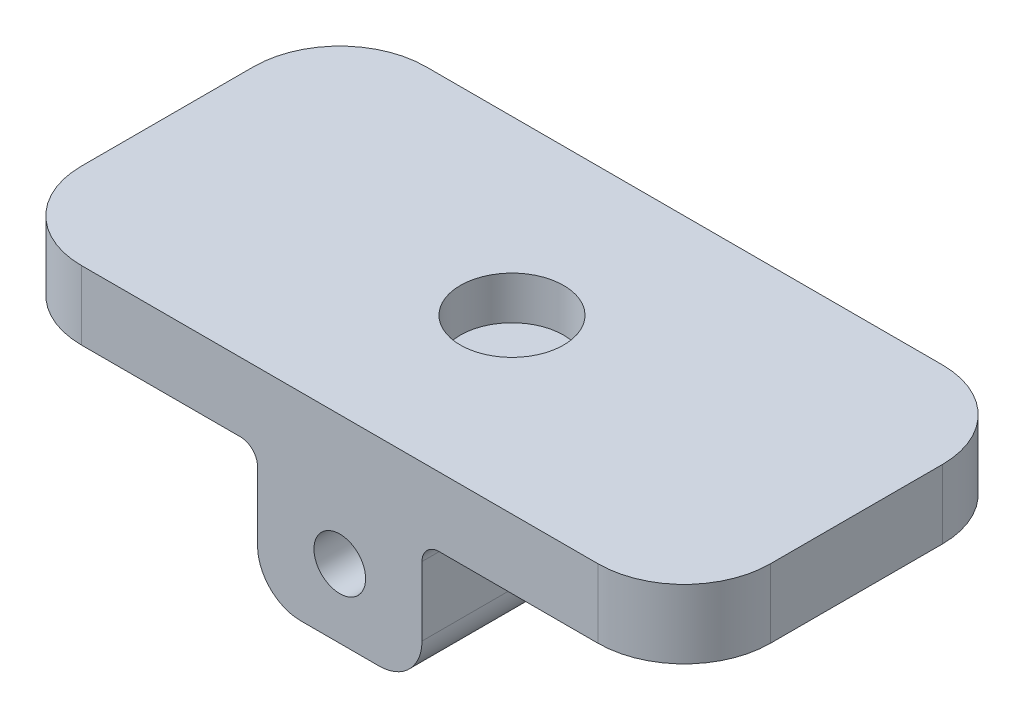
ISO-10303-21;
HEADER;
FILE_DESCRIPTION(('STEP AP214'),'2;1');
FILE_NAME('part.step','',(''),(''),'','','');
FILE_SCHEMA(('AUTOMOTIVE_DESIGN { 1 0 10303 214 1 1 1 1 }'));
ENDSEC;
DATA;
#1=APPLICATION_CONTEXT('core data for automotive mechanical design processes');
#2=APPLICATION_PROTOCOL_DEFINITION('international standard','automotive_design',2000,#1);
#3=PRODUCT_CONTEXT('',#1,'mechanical');
#4=PRODUCT('Part','Part','',(#3));
#5=PRODUCT_RELATED_PRODUCT_CATEGORY('part','',(#4));
#6=PRODUCT_DEFINITION_FORMATION('','',#4);
#7=PRODUCT_DEFINITION_CONTEXT('part definition',#1,'design');
#8=PRODUCT_DEFINITION('design','',#6,#7);
#9=PRODUCT_DEFINITION_SHAPE('','',#8);
#10=(LENGTH_UNIT() NAMED_UNIT(*) SI_UNIT(.MILLI.,.METRE.));
#11=(NAMED_UNIT(*) PLANE_ANGLE_UNIT() SI_UNIT($,.RADIAN.));
#12=(NAMED_UNIT(*) SI_UNIT($,.STERADIAN.) SOLID_ANGLE_UNIT());
#13=UNCERTAINTY_MEASURE_WITH_UNIT(LENGTH_MEASURE(1.E-05),#10,'distance_accuracy_value','');
#14=(GEOMETRIC_REPRESENTATION_CONTEXT(3) GLOBAL_UNCERTAINTY_ASSIGNED_CONTEXT((#13)) GLOBAL_UNIT_ASSIGNED_CONTEXT((#10,
#11,#12)) REPRESENTATION_CONTEXT('',''));
#15=CARTESIAN_POINT('',(0.,0.,0.));
#16=DIRECTION('',(0.,0.,1.));
#17=DIRECTION('',(1.,0.,0.));
#18=AXIS2_PLACEMENT_3D('',#15,#16,#17);
#19=CARTESIAN_POINT('',(-9.54545454545454,-8.00000000000001,40.));
#20=DIRECTION('',(1.,0.,0.));
#21=DIRECTION('',(0.,1.,0.));
#22=AXIS2_PLACEMENT_3D('',#19,#20,#21);
#23=PLANE('',#22);
#24=DIRECTION('',(0.,1.,0.));
#25=VECTOR('',#24,1.);
#26=CARTESIAN_POINT('',(-9.54545454545454,-8.00000000000001,18.));
#27=LINE('',#26,#25);
#28=CARTESIAN_POINT('',(-9.54545454545454,-18.,18.));
#29=VERTEX_POINT('',#28);
#30=CARTESIAN_POINT('',(-9.54545454545454,-10.,18.));
#31=VERTEX_POINT('',#30);
#32=EDGE_CURVE('E263',#29,#31,#27,.T.);
#33=ORIENTED_EDGE('',*,*,#32,.T.);
#34=DIRECTION('',(0.,0.,-1.));
#35=VECTOR('',#34,1.);
#36=CARTESIAN_POINT('',(-9.54545454545454,-10.,0.));
#37=LINE('',#36,#35);
#38=CARTESIAN_POINT('',(-9.54545454545454,-10.,0.));
#39=VERTEX_POINT('',#38);
#40=EDGE_CURVE('E335',#31,#39,#37,.T.);
#41=ORIENTED_EDGE('',*,*,#40,.T.);
#42=DIRECTION('',(0.,-1.,0.));
#43=VECTOR('',#42,1.);
#44=CARTESIAN_POINT('',(-9.54545454545454,-8.00000000000001,0.));
#45=LINE('',#44,#43);
#46=CARTESIAN_POINT('',(-9.54545454545454,-18.,0.));
#47=VERTEX_POINT('',#46);
#48=EDGE_CURVE('E369',#39,#47,#45,.T.);
#49=ORIENTED_EDGE('',*,*,#48,.T.);
#50=DIRECTION('',(0.,0.,-1.));
#51=VECTOR('',#50,1.);
#52=CARTESIAN_POINT('',(-9.54545454545454,-18.,40.));
#53=LINE('',#52,#51);
#54=EDGE_CURVE('E338',#47,#29,#53,.F.);
#55=ORIENTED_EDGE('',*,*,#54,.T.);
#56=EDGE_LOOP('',(#33,#41,#49,#55));
#57=FACE_BOUND('',#56,.T.);
#58=ADVANCED_FACE('F33',(#57),#23,.F.);
#59=CARTESIAN_POINT('',(-9.54545454545454,-23.,40.));
#60=DIRECTION('',(0.,1.,0.));
#61=DIRECTION('',(0.,0.,1.));
#62=AXIS2_PLACEMENT_3D('',#59,#60,#61);
#63=PLANE('',#62);
#64=DIRECTION('',(1.,0.,0.));
#65=VECTOR('',#64,1.);
#66=CARTESIAN_POINT('',(-9.54545454545454,-23.,0.));
#67=LINE('',#66,#65);
#68=CARTESIAN_POINT('',(-4.54545454545454,-23.,0.));
#69=VERTEX_POINT('',#68);
#70=CARTESIAN_POINT('',(4.54545454545455,-23.,0.));
#71=VERTEX_POINT('',#70);
#72=EDGE_CURVE('E419',#69,#71,#67,.T.);
#73=ORIENTED_EDGE('',*,*,#72,.T.);
#74=DIRECTION('',(0.,0.,-1.));
#75=VECTOR('',#74,1.);
#76=CARTESIAN_POINT('',(4.54545454545455,-23.,40.));
#77=LINE('',#76,#75);
#78=CARTESIAN_POINT('',(4.54545454545455,-23.,18.));
#79=VERTEX_POINT('',#78);
#80=EDGE_CURVE('E471',#71,#79,#77,.F.);
#81=ORIENTED_EDGE('',*,*,#80,.T.);
#82=DIRECTION('',(1.,0.,0.));
#83=VECTOR('',#82,1.);
#84=CARTESIAN_POINT('',(-40.,-23.,18.));
#85=LINE('',#84,#83);
#86=CARTESIAN_POINT('',(-4.54545454545454,-23.,18.));
#87=VERTEX_POINT('',#86);
#88=EDGE_CURVE('E436',#87,#79,#85,.T.);
#89=ORIENTED_EDGE('',*,*,#88,.F.);
#90=DIRECTION('',(0.,0.,-1.));
#91=VECTOR('',#90,1.);
#92=CARTESIAN_POINT('',(-4.54545454545454,-23.,40.));
#93=LINE('',#92,#91);
#94=EDGE_CURVE('E473',#87,#69,#93,.T.);
#95=ORIENTED_EDGE('',*,*,#94,.T.);
#96=EDGE_LOOP('',(#73,#81,#89,#95));
#97=FACE_BOUND('',#96,.T.);
#98=ADVANCED_FACE('F313',(#97),#63,.F.);
#99=CARTESIAN_POINT('',(9.54545454545456,-8.00000000000001,40.));
#100=DIRECTION('',(-1.,0.,0.));
#101=DIRECTION('',(0.,-1.,0.));
#102=AXIS2_PLACEMENT_3D('',#99,#100,#101);
#103=PLANE('',#102);
#104=DIRECTION('',(0.,1.,0.));
#105=VECTOR('',#104,1.);
#106=CARTESIAN_POINT('',(9.54545454545456,-8.00000000000001,0.));
#107=LINE('',#106,#105);
#108=CARTESIAN_POINT('',(9.54545454545455,-18.,0.));
#109=VERTEX_POINT('',#108);
#110=CARTESIAN_POINT('',(9.54545454545456,-10.,0.));
#111=VERTEX_POINT('',#110);
#112=EDGE_CURVE('E397',#109,#111,#107,.T.);
#113=ORIENTED_EDGE('',*,*,#112,.T.);
#114=DIRECTION('',(0.,0.,-1.));
#115=VECTOR('',#114,1.);
#116=CARTESIAN_POINT('',(9.54545454545456,-10.,18.));
#117=LINE('',#116,#115);
#118=CARTESIAN_POINT('',(9.54545454545456,-10.,18.));
#119=VERTEX_POINT('',#118);
#120=EDGE_CURVE('E348',#111,#119,#117,.F.);
#121=ORIENTED_EDGE('',*,*,#120,.T.);
#122=DIRECTION('',(0.,-1.,0.));
#123=VECTOR('',#122,1.);
#124=CARTESIAN_POINT('',(9.54545454545456,-8.00000000000001,18.));
#125=LINE('',#124,#123);
#126=CARTESIAN_POINT('',(9.54545454545455,-18.,18.));
#127=VERTEX_POINT('',#126);
#128=EDGE_CURVE('E340',#119,#127,#125,.T.);
#129=ORIENTED_EDGE('',*,*,#128,.T.);
#130=DIRECTION('',(0.,0.,-1.));
#131=VECTOR('',#130,1.);
#132=CARTESIAN_POINT('',(9.54545454545455,-18.,40.));
#133=LINE('',#132,#131);
#134=EDGE_CURVE('E486',#127,#109,#133,.T.);
#135=ORIENTED_EDGE('',*,*,#134,.T.);
#136=EDGE_LOOP('',(#113,#121,#129,#135));
#137=FACE_BOUND('',#136,.T.);
#138=ADVANCED_FACE('F309',(#137),#103,.F.);
#139=CARTESIAN_POINT('',(0.,-15.,40.));
#140=DIRECTION('',(0.,0.,-1.));
#141=DIRECTION('',(-1.,0.,0.));
#142=AXIS2_PLACEMENT_3D('',#139,#140,#141);
#143=CYLINDRICAL_SURFACE('',#142,3.);
#144=CARTESIAN_POINT('',(0.,-15.,18.));
#145=DIRECTION('',(0.,0.,-1.));
#146=DIRECTION('',(-1.,0.,0.));
#147=AXIS2_PLACEMENT_3D('',#144,#145,#146);
#148=CIRCLE('',#147,3.);
#149=CARTESIAN_POINT('',(-3.,-15.,18.));
#150=VERTEX_POINT('',#149);
#151=EDGE_CURVE('E226',#150,#150,#148,.T.);
#152=ORIENTED_EDGE('',*,*,#151,.F.);
#153=EDGE_LOOP('',(#152));
#154=FACE_BOUND('',#153,.T.);
#155=CARTESIAN_POINT('',(0.,-15.,0.));
#156=DIRECTION('',(0.,0.,1.));
#157=DIRECTION('',(1.,0.,0.));
#158=AXIS2_PLACEMENT_3D('',#155,#156,#157);
#159=CIRCLE('',#158,3.);
#160=CARTESIAN_POINT('',(3.,-15.,0.));
#161=VERTEX_POINT('',#160);
#162=EDGE_CURVE('E448',#161,#161,#159,.T.);
#163=ORIENTED_EDGE('',*,*,#162,.F.);
#164=EDGE_LOOP('',(#163));
#165=FACE_BOUND('',#164,.T.);
#166=ADVANCED_FACE('F282',(#154,#165),#143,.F.);
#167=CARTESIAN_POINT('',(0.,0.,40.));
#168=DIRECTION('',(0.,0.,-1.));
#169=DIRECTION('',(-1.,0.,0.));
#170=AXIS2_PLACEMENT_3D('',#167,#168,#169);
#171=PLANE('',#170);
#172=DIRECTION('',(1.,0.,0.));
#173=VECTOR('',#172,1.);
#174=CARTESIAN_POINT('',(-9.54545454545454,-23.,40.));
#175=LINE('',#174,#173);
#176=CARTESIAN_POINT('',(-4.54545454545454,-23.,40.));
#177=VERTEX_POINT('',#176);
#178=CARTESIAN_POINT('',(4.54545454545455,-23.,40.));
#179=VERTEX_POINT('',#178);
#180=EDGE_CURVE('E457',#177,#179,#175,.T.);
#181=ORIENTED_EDGE('',*,*,#180,.T.);
#182=CARTESIAN_POINT('',(4.54545454545455,-18.,40.));
#183=DIRECTION('',(0.,0.,-1.));
#184=DIRECTION('',(-1.,0.,0.));
#185=AXIS2_PLACEMENT_3D('',#182,#183,#184);
#186=CIRCLE('',#185,5.);
#187=CARTESIAN_POINT('',(9.54545454545455,-18.,40.));
#188=VERTEX_POINT('',#187);
#189=EDGE_CURVE('E488',#179,#188,#186,.F.);
#190=ORIENTED_EDGE('',*,*,#189,.T.);
#191=DIRECTION('',(0.,1.,0.));
#192=VECTOR('',#191,1.);
#193=CARTESIAN_POINT('',(9.54545454545456,-8.00000000000001,40.));
#194=LINE('',#193,#192);
#195=CARTESIAN_POINT('',(9.54545454545456,-10.,40.));
#196=VERTEX_POINT('',#195);
#197=EDGE_CURVE('E460',#188,#196,#194,.T.);
#198=ORIENTED_EDGE('',*,*,#197,.T.);
#199=CARTESIAN_POINT('',(11.5454545454546,-10.,40.));
#200=DIRECTION('',(0.,0.,-1.));
#201=DIRECTION('',(-1.,0.,0.));
#202=AXIS2_PLACEMENT_3D('',#199,#200,#201);
#203=CIRCLE('',#202,2.);
#204=CARTESIAN_POINT('',(11.5454545454546,-8.00000000000001,40.));
#205=VERTEX_POINT('',#204);
#206=EDGE_CURVE('E345',#196,#205,#203,.T.);
#207=ORIENTED_EDGE('',*,*,#206,.T.);
#208=DIRECTION('',(1.,0.,0.));
#209=VECTOR('',#208,1.);
#210=CARTESIAN_POINT('',(9.54545454545456,-8.00000000000001,40.));
#211=LINE('',#210,#209);
#212=CARTESIAN_POINT('',(30.,-7.99999999999999,40.));
#213=VERTEX_POINT('',#212);
#214=EDGE_CURVE('E463',#205,#213,#211,.T.);
#215=ORIENTED_EDGE('',*,*,#214,.T.);
#216=DIRECTION('',(0.,1.,0.));
#217=VECTOR('',#216,1.);
#218=CARTESIAN_POINT('',(30.,0.,40.));
#219=LINE('',#218,#217);
#220=CARTESIAN_POINT('',(30.,0.,40.));
#221=VERTEX_POINT('',#220);
#222=EDGE_CURVE('E247',#213,#221,#219,.T.);
#223=ORIENTED_EDGE('',*,*,#222,.T.);
#224=DIRECTION('',(-1.,0.,0.));
#225=VECTOR('',#224,1.);
#226=CARTESIAN_POINT('',(40.,0.,40.));
#227=LINE('',#226,#225);
#228=CARTESIAN_POINT('',(-30.,0.,40.));
#229=VERTEX_POINT('',#228);
#230=EDGE_CURVE('E198',#221,#229,#227,.T.);
#231=ORIENTED_EDGE('',*,*,#230,.T.);
#232=DIRECTION('',(0.,-1.,0.));
#233=VECTOR('',#232,1.);
#234=CARTESIAN_POINT('',(-30.,0.,40.));
#235=LINE('',#234,#233);
#236=CARTESIAN_POINT('',(-30.,-8.00000000000001,40.));
#237=VERTEX_POINT('',#236);
#238=EDGE_CURVE('E244',#229,#237,#235,.T.);
#239=ORIENTED_EDGE('',*,*,#238,.T.);
#240=DIRECTION('',(1.,0.,0.));
#241=VECTOR('',#240,1.);
#242=CARTESIAN_POINT('',(-40.,-8.00000000000001,40.));
#243=LINE('',#242,#241);
#244=CARTESIAN_POINT('',(-11.5454545454545,-8.00000000000001,40.));
#245=VERTEX_POINT('',#244);
#246=EDGE_CURVE('E417',#237,#245,#243,.T.);
#247=ORIENTED_EDGE('',*,*,#246,.T.);
#248=CARTESIAN_POINT('',(-11.5454545454545,-10.,40.));
#249=DIRECTION('',(0.,0.,-1.));
#250=DIRECTION('',(-1.,0.,0.));
#251=AXIS2_PLACEMENT_3D('',#248,#249,#250);
#252=CIRCLE('',#251,2.);
#253=CARTESIAN_POINT('',(-9.54545454545454,-10.,40.));
#254=VERTEX_POINT('',#253);
#255=EDGE_CURVE('E361',#245,#254,#252,.T.);
#256=ORIENTED_EDGE('',*,*,#255,.T.);
#257=DIRECTION('',(0.,-1.,0.));
#258=VECTOR('',#257,1.);
#259=CARTESIAN_POINT('',(-9.54545454545454,-8.00000000000001,40.));
#260=LINE('',#259,#258);
#261=CARTESIAN_POINT('',(-9.54545454545454,-18.,40.));
#262=VERTEX_POINT('',#261);
#263=EDGE_CURVE('E455',#254,#262,#260,.T.);
#264=ORIENTED_EDGE('',*,*,#263,.T.);
#265=CARTESIAN_POINT('',(-4.54545454545454,-18.,40.));
#266=DIRECTION('',(0.,0.,-1.));
#267=DIRECTION('',(-1.,0.,0.));
#268=AXIS2_PLACEMENT_3D('',#265,#266,#267);
#269=CIRCLE('',#268,5.);
#270=EDGE_CURVE('E490',#262,#177,#269,.F.);
#271=ORIENTED_EDGE('',*,*,#270,.T.);
#272=EDGE_LOOP('',(#181,#190,#198,#207,#215,#223,#231,#239,#247,#256,#264,#271));
#273=FACE_BOUND('',#272,.T.);
#274=CARTESIAN_POINT('',(0.,-15.,40.));
#275=DIRECTION('',(0.,0.,1.));
#276=DIRECTION('',(1.,0.,0.));
#277=AXIS2_PLACEMENT_3D('',#274,#275,#276);
#278=CIRCLE('',#277,3.);
#279=CARTESIAN_POINT('',(3.,-15.,40.));
#280=VERTEX_POINT('',#279);
#281=EDGE_CURVE('E374',#280,#280,#278,.T.);
#282=ORIENTED_EDGE('',*,*,#281,.F.);
#283=EDGE_LOOP('',(#282));
#284=FACE_BOUND('',#283,.T.);
#285=ADVANCED_FACE('F283',(#273,#284),#171,.F.);
#286=CARTESIAN_POINT('',(0.,0.,0.));
#287=DIRECTION('',(0.,0.,-1.));
#288=DIRECTION('',(-1.,0.,0.));
#289=AXIS2_PLACEMENT_3D('',#286,#287,#288);
#290=PLANE('',#289);
#291=ORIENTED_EDGE('',*,*,#112,.F.);
#292=CARTESIAN_POINT('',(4.54545454545455,-18.,0.));
#293=DIRECTION('',(0.,0.,-1.));
#294=DIRECTION('',(-1.,0.,0.));
#295=AXIS2_PLACEMENT_3D('',#292,#293,#294);
#296=CIRCLE('',#295,5.);
#297=EDGE_CURVE('E476',#109,#71,#296,.T.);
#298=ORIENTED_EDGE('',*,*,#297,.T.);
#299=ORIENTED_EDGE('',*,*,#72,.F.);
#300=CARTESIAN_POINT('',(-4.54545454545454,-18.,0.));
#301=DIRECTION('',(0.,0.,-1.));
#302=DIRECTION('',(-1.,0.,0.));
#303=AXIS2_PLACEMENT_3D('',#300,#301,#302);
#304=CIRCLE('',#303,5.);
#305=EDGE_CURVE('E484',#69,#47,#304,.T.);
#306=ORIENTED_EDGE('',*,*,#305,.T.);
#307=ORIENTED_EDGE('',*,*,#48,.F.);
#308=CARTESIAN_POINT('',(-11.5454545454545,-10.,0.));
#309=DIRECTION('',(0.,0.,-1.));
#310=DIRECTION('',(-1.,0.,0.));
#311=AXIS2_PLACEMENT_3D('',#308,#309,#310);
#312=CIRCLE('',#311,2.);
#313=CARTESIAN_POINT('',(-11.5454545454545,-8.00000000000001,0.));
#314=VERTEX_POINT('',#313);
#315=EDGE_CURVE('E41',#39,#314,#312,.F.);
#316=ORIENTED_EDGE('',*,*,#315,.T.);
#317=DIRECTION('',(1.,0.,0.));
#318=VECTOR('',#317,1.);
#319=CARTESIAN_POINT('',(-40.,-8.00000000000001,0.));
#320=LINE('',#319,#318);
#321=CARTESIAN_POINT('',(-30.,-8.00000000000001,0.));
#322=VERTEX_POINT('',#321);
#323=EDGE_CURVE('E366',#322,#314,#320,.T.);
#324=ORIENTED_EDGE('',*,*,#323,.F.);
#325=DIRECTION('',(0.,-1.,0.));
#326=VECTOR('',#325,1.);
#327=CARTESIAN_POINT('',(-30.,0.,0.));
#328=LINE('',#327,#326);
#329=CARTESIAN_POINT('',(-30.,0.,0.));
#330=VERTEX_POINT('',#329);
#331=EDGE_CURVE('E232',#322,#330,#328,.F.);
#332=ORIENTED_EDGE('',*,*,#331,.T.);
#333=DIRECTION('',(-1.,0.,0.));
#334=VECTOR('',#333,1.);
#335=CARTESIAN_POINT('',(40.,0.,0.));
#336=LINE('',#335,#334);
#337=CARTESIAN_POINT('',(30.,0.,0.));
#338=VERTEX_POINT('',#337);
#339=EDGE_CURVE('E414',#338,#330,#336,.T.);
#340=ORIENTED_EDGE('',*,*,#339,.F.);
#341=DIRECTION('',(0.,1.,0.));
#342=VECTOR('',#341,1.);
#343=CARTESIAN_POINT('',(30.,-7.99999999999999,0.));
#344=LINE('',#343,#342);
#345=CARTESIAN_POINT('',(30.,-7.99999999999999,0.));
#346=VERTEX_POINT('',#345);
#347=EDGE_CURVE('E234',#338,#346,#344,.F.);
#348=ORIENTED_EDGE('',*,*,#347,.T.);
#349=DIRECTION('',(1.,0.,0.));
#350=VECTOR('',#349,1.);
#351=CARTESIAN_POINT('',(9.54545454545456,-8.00000000000001,0.));
#352=LINE('',#351,#350);
#353=CARTESIAN_POINT('',(11.5454545454546,-8.00000000000001,0.));
#354=VERTEX_POINT('',#353);
#355=EDGE_CURVE('E409',#354,#346,#352,.T.);
#356=ORIENTED_EDGE('',*,*,#355,.F.);
#357=CARTESIAN_POINT('',(11.5454545454546,-10.,0.));
#358=DIRECTION('',(0.,0.,-1.));
#359=DIRECTION('',(-1.,0.,0.));
#360=AXIS2_PLACEMENT_3D('',#357,#358,#359);
#361=CIRCLE('',#360,2.);
#362=EDGE_CURVE('E353',#354,#111,#361,.F.);
#363=ORIENTED_EDGE('',*,*,#362,.T.);
#364=EDGE_LOOP('',(#291,#298,#299,#306,#307,#316,#324,#332,#340,#348,#356,#363));
#365=FACE_BOUND('',#364,.T.);
#366=ORIENTED_EDGE('',*,*,#162,.T.);
#367=EDGE_LOOP('',(#366));
#368=FACE_BOUND('',#367,.T.);
#369=ADVANCED_FACE('F286',(#365,#368),#290,.T.);
#370=ORIENTED_EDGE('',*,*,#263,.F.);
#371=DIRECTION('',(0.,0.,-1.));
#372=VECTOR('',#371,1.);
#373=CARTESIAN_POINT('',(-9.54545454545454,-10.,22.));
#374=LINE('',#373,#372);
#375=CARTESIAN_POINT('',(-9.54545454545454,-10.,22.));
#376=VERTEX_POINT('',#375);
#377=EDGE_CURVE('E343',#254,#376,#374,.T.);
#378=ORIENTED_EDGE('',*,*,#377,.T.);
#379=DIRECTION('',(0.,-1.,0.));
#380=VECTOR('',#379,1.);
#381=CARTESIAN_POINT('',(-9.54545454545454,-8.00000000000001,22.));
#382=LINE('',#381,#380);
#383=CARTESIAN_POINT('',(-9.54545454545454,-18.,22.));
#384=VERTEX_POINT('',#383);
#385=EDGE_CURVE('E432',#376,#384,#382,.T.);
#386=ORIENTED_EDGE('',*,*,#385,.T.);
#387=DIRECTION('',(0.,0.,-1.));
#388=VECTOR('',#387,1.);
#389=CARTESIAN_POINT('',(-9.54545454545454,-18.,40.));
#390=LINE('',#389,#388);
#391=EDGE_CURVE('E377',#384,#262,#390,.F.);
#392=ORIENTED_EDGE('',*,*,#391,.T.);
#393=EDGE_LOOP('',(#370,#378,#386,#392));
#394=FACE_BOUND('',#393,.T.);
#395=ADVANCED_FACE('F290',(#394),#23,.F.);
#396=DIRECTION('',(-1.,0.,0.));
#397=VECTOR('',#396,1.);
#398=CARTESIAN_POINT('',(-40.,-23.,22.));
#399=LINE('',#398,#397);
#400=CARTESIAN_POINT('',(4.54545454545455,-23.,22.));
#401=VERTEX_POINT('',#400);
#402=CARTESIAN_POINT('',(-4.54545454545454,-23.,22.));
#403=VERTEX_POINT('',#402);
#404=EDGE_CURVE('E440',#401,#403,#399,.T.);
#405=ORIENTED_EDGE('',*,*,#404,.F.);
#406=DIRECTION('',(0.,0.,-1.));
#407=VECTOR('',#406,1.);
#408=CARTESIAN_POINT('',(4.54545454545455,-23.,40.));
#409=LINE('',#408,#407);
#410=EDGE_CURVE('E492',#401,#179,#409,.F.);
#411=ORIENTED_EDGE('',*,*,#410,.T.);
#412=ORIENTED_EDGE('',*,*,#180,.F.);
#413=DIRECTION('',(0.,0.,-1.));
#414=VECTOR('',#413,1.);
#415=CARTESIAN_POINT('',(-4.54545454545454,-23.,40.));
#416=LINE('',#415,#414);
#417=EDGE_CURVE('E494',#177,#403,#416,.T.);
#418=ORIENTED_EDGE('',*,*,#417,.T.);
#419=EDGE_LOOP('',(#405,#411,#412,#418));
#420=FACE_BOUND('',#419,.T.);
#421=ADVANCED_FACE('F307',(#420),#63,.F.);
#422=DIRECTION('',(0.,1.,0.));
#423=VECTOR('',#422,1.);
#424=CARTESIAN_POINT('',(9.54545454545456,-8.00000000000001,22.));
#425=LINE('',#424,#423);
#426=CARTESIAN_POINT('',(9.54545454545455,-18.,22.));
#427=VERTEX_POINT('',#426);
#428=CARTESIAN_POINT('',(9.54545454545456,-10.,22.));
#429=VERTEX_POINT('',#428);
#430=EDGE_CURVE('E428',#427,#429,#425,.T.);
#431=ORIENTED_EDGE('',*,*,#430,.T.);
#432=DIRECTION('',(0.,0.,-1.));
#433=VECTOR('',#432,1.);
#434=CARTESIAN_POINT('',(9.54545454545456,-10.,40.));
#435=LINE('',#434,#433);
#436=EDGE_CURVE('E390',#429,#196,#435,.F.);
#437=ORIENTED_EDGE('',*,*,#436,.T.);
#438=ORIENTED_EDGE('',*,*,#197,.F.);
#439=DIRECTION('',(0.,0.,-1.));
#440=VECTOR('',#439,1.);
#441=CARTESIAN_POINT('',(9.54545454545455,-18.,40.));
#442=LINE('',#441,#440);
#443=EDGE_CURVE('E254',#188,#427,#442,.T.);
#444=ORIENTED_EDGE('',*,*,#443,.T.);
#445=EDGE_LOOP('',(#431,#437,#438,#444));
#446=FACE_BOUND('',#445,.T.);
#447=ADVANCED_FACE('F303',(#446),#103,.F.);
#448=CARTESIAN_POINT('',(9.54545454545456,-8.00000000000001,40.));
#449=DIRECTION('',(0.,1.,0.));
#450=DIRECTION('',(-1.,0.,0.));
#451=AXIS2_PLACEMENT_3D('',#448,#449,#450);
#452=PLANE('',#451);
#453=ORIENTED_EDGE('',*,*,#214,.F.);
#454=DIRECTION('',(0.,0.,-1.));
#455=VECTOR('',#454,1.);
#456=CARTESIAN_POINT('',(11.5454545454546,-8.00000000000001,22.));
#457=LINE('',#456,#455);
#458=CARTESIAN_POINT('',(11.5454545454546,-8.00000000000001,22.));
#459=VERTEX_POINT('',#458);
#460=EDGE_CURVE('E387',#205,#459,#457,.T.);
#461=ORIENTED_EDGE('',*,*,#460,.T.);
#462=DIRECTION('',(-1.,0.,0.));
#463=VECTOR('',#462,1.);
#464=CARTESIAN_POINT('',(-40.,-8.00000000000001,22.));
#465=LINE('',#464,#463);
#466=CARTESIAN_POINT('',(-11.5454545454545,-8.00000000000003,22.));
#467=VERTEX_POINT('',#466);
#468=EDGE_CURVE('E434',#459,#467,#465,.T.);
#469=ORIENTED_EDGE('',*,*,#468,.T.);
#470=DIRECTION('',(0.,0.,-1.));
#471=VECTOR('',#470,1.);
#472=CARTESIAN_POINT('',(-11.5454545454545,-8.00000000000003,40.));
#473=LINE('',#472,#471);
#474=EDGE_CURVE('E376',#467,#245,#473,.F.);
#475=ORIENTED_EDGE('',*,*,#474,.T.);
#476=ORIENTED_EDGE('',*,*,#246,.F.);
#477=CARTESIAN_POINT('',(-30.,-8.00000000000004,30.));
#478=DIRECTION('',(0.,1.,0.));
#479=DIRECTION('',(-1.,0.,0.));
#480=AXIS2_PLACEMENT_3D('',#477,#478,#479);
#481=CIRCLE('',#480,10.);
#482=CARTESIAN_POINT('',(-40.,-8.00000000000001,30.));
#483=VERTEX_POINT('',#482);
#484=EDGE_CURVE('E237',#237,#483,#481,.F.);
#485=ORIENTED_EDGE('',*,*,#484,.T.);
#486=DIRECTION('',(0.,0.,-1.));
#487=VECTOR('',#486,1.);
#488=CARTESIAN_POINT('',(-40.,-8.00000000000001,40.));
#489=LINE('',#488,#487);
#490=CARTESIAN_POINT('',(-40.,-8.00000000000001,10.));
#491=VERTEX_POINT('',#490);
#492=EDGE_CURVE('E423',#483,#491,#489,.T.);
#493=ORIENTED_EDGE('',*,*,#492,.T.);
#494=CARTESIAN_POINT('',(-30.,-8.00000000000004,10.));
#495=DIRECTION('',(0.,1.,0.));
#496=DIRECTION('',(-1.,0.,0.));
#497=AXIS2_PLACEMENT_3D('',#494,#495,#496);
#498=CIRCLE('',#497,10.);
#499=EDGE_CURVE('E239',#491,#322,#498,.F.);
#500=ORIENTED_EDGE('',*,*,#499,.T.);
#501=ORIENTED_EDGE('',*,*,#323,.T.);
#502=DIRECTION('',(0.,0.,-1.));
#503=VECTOR('',#502,1.);
#504=CARTESIAN_POINT('',(-11.5454545454545,-8.00000000000003,18.));
#505=LINE('',#504,#503);
#506=CARTESIAN_POINT('',(-11.5454545454545,-8.00000000000001,18.));
#507=VERTEX_POINT('',#506);
#508=EDGE_CURVE('E372',#314,#507,#505,.F.);
#509=ORIENTED_EDGE('',*,*,#508,.T.);
#510=DIRECTION('',(1.,0.,0.));
#511=VECTOR('',#510,1.);
#512=CARTESIAN_POINT('',(-40.,-8.00000000000001,18.));
#513=LINE('',#512,#511);
#514=CARTESIAN_POINT('',(11.5454545454546,-8.00000000000001,18.));
#515=VERTEX_POINT('',#514);
#516=EDGE_CURVE('E410',#507,#515,#513,.T.);
#517=ORIENTED_EDGE('',*,*,#516,.T.);
#518=DIRECTION('',(0.,0.,-1.));
#519=VECTOR('',#518,1.);
#520=CARTESIAN_POINT('',(11.5454545454546,-8.00000000000001,0.));
#521=LINE('',#520,#519);
#522=EDGE_CURVE('E379',#515,#354,#521,.T.);
#523=ORIENTED_EDGE('',*,*,#522,.T.);
#524=ORIENTED_EDGE('',*,*,#355,.T.);
#525=CARTESIAN_POINT('',(30.,-7.99999999999999,10.));
#526=DIRECTION('',(0.,1.,0.));
#527=DIRECTION('',(-1.,0.,0.));
#528=AXIS2_PLACEMENT_3D('',#525,#526,#527);
#529=CIRCLE('',#528,10.);
#530=CARTESIAN_POINT('',(40.,-7.99999999999999,10.));
#531=VERTEX_POINT('',#530);
#532=EDGE_CURVE('E242',#346,#531,#529,.F.);
#533=ORIENTED_EDGE('',*,*,#532,.T.);
#534=DIRECTION('',(0.,0.,-1.));
#535=VECTOR('',#534,1.);
#536=CARTESIAN_POINT('',(40.,-7.99999999999999,40.));
#537=LINE('',#536,#535);
#538=CARTESIAN_POINT('',(40.,-7.99999999999999,30.));
#539=VERTEX_POINT('',#538);
#540=EDGE_CURVE('E214',#539,#531,#537,.T.);
#541=ORIENTED_EDGE('',*,*,#540,.F.);
#542=CARTESIAN_POINT('',(30.,-7.99999999999999,30.));
#543=DIRECTION('',(0.,1.,0.));
#544=DIRECTION('',(-1.,0.,0.));
#545=AXIS2_PLACEMENT_3D('',#542,#543,#544);
#546=CIRCLE('',#545,10.);
#547=EDGE_CURVE('E220',#539,#213,#546,.F.);
#548=ORIENTED_EDGE('',*,*,#547,.T.);
#549=EDGE_LOOP('',(#453,#461,#469,#475,#476,#485,#493,#500,#501,#509,#517,#523,#524,#533,#541,#548));
#550=FACE_BOUND('',#549,.T.);
#551=ADVANCED_FACE('F300',(#550),#452,.F.);
#552=CARTESIAN_POINT('',(40.,-7.99999999999999,40.));
#553=DIRECTION('',(-1.,0.,0.));
#554=DIRECTION('',(0.,0.,1.));
#555=AXIS2_PLACEMENT_3D('',#552,#553,#554);
#556=PLANE('',#555);
#557=ORIENTED_EDGE('',*,*,#540,.T.);
#558=DIRECTION('',(0.,1.,0.));
#559=VECTOR('',#558,1.);
#560=CARTESIAN_POINT('',(40.,0.,10.));
#561=LINE('',#560,#559);
#562=CARTESIAN_POINT('',(40.,0.,10.));
#563=VERTEX_POINT('',#562);
#564=EDGE_CURVE('E213',#531,#563,#561,.T.);
#565=ORIENTED_EDGE('',*,*,#564,.T.);
#566=DIRECTION('',(0.,0.,-1.));
#567=VECTOR('',#566,1.);
#568=CARTESIAN_POINT('',(40.,0.,40.));
#569=LINE('',#568,#567);
#570=CARTESIAN_POINT('',(40.,0.,30.));
#571=VERTEX_POINT('',#570);
#572=EDGE_CURVE('E196',#571,#563,#569,.T.);
#573=ORIENTED_EDGE('',*,*,#572,.F.);
#574=DIRECTION('',(0.,1.,0.));
#575=VECTOR('',#574,1.);
#576=CARTESIAN_POINT('',(40.,-7.99999999999999,30.));
#577=LINE('',#576,#575);
#578=EDGE_CURVE('E210',#571,#539,#577,.F.);
#579=ORIENTED_EDGE('',*,*,#578,.T.);
#580=EDGE_LOOP('',(#557,#565,#573,#579));
#581=FACE_BOUND('',#580,.T.);
#582=ADVANCED_FACE('F209',(#581),#556,.F.);
#583=CARTESIAN_POINT('',(40.,0.,40.));
#584=DIRECTION('',(0.,-1.,0.));
#585=DIRECTION('',(1.,0.,0.));
#586=AXIS2_PLACEMENT_3D('',#583,#584,#585);
#587=PLANE('',#586);
#588=CARTESIAN_POINT('',(0.,0.,20.));
#589=DIRECTION('',(0.,1.,0.));
#590=DIRECTION('',(-1.,0.,0.));
#591=AXIS2_PLACEMENT_3D('',#588,#589,#590);
#592=CIRCLE('',#591,6.);
#593=CARTESIAN_POINT('',(-6.,0.,20.));
#594=VERTEX_POINT('',#593);
#595=EDGE_CURVE('E778',#594,#594,#592,.T.);
#596=ORIENTED_EDGE('',*,*,#595,.F.);
#597=EDGE_LOOP('',(#596));
#598=FACE_BOUND('',#597,.T.);
#599=ORIENTED_EDGE('',*,*,#572,.T.);
#600=CARTESIAN_POINT('',(30.,0.,10.));
#601=DIRECTION('',(0.,-1.,0.));
#602=DIRECTION('',(1.,0.,0.));
#603=AXIS2_PLACEMENT_3D('',#600,#601,#602);
#604=CIRCLE('',#603,10.);
#605=EDGE_CURVE('E203',#563,#338,#604,.F.);
#606=ORIENTED_EDGE('',*,*,#605,.T.);
#607=ORIENTED_EDGE('',*,*,#339,.T.);
#608=CARTESIAN_POINT('',(-30.,0.,10.));
#609=DIRECTION('',(0.,-1.,0.));
#610=DIRECTION('',(1.,0.,0.));
#611=AXIS2_PLACEMENT_3D('',#608,#609,#610);
#612=CIRCLE('',#611,10.);
#613=CARTESIAN_POINT('',(-40.,0.,10.));
#614=VERTEX_POINT('',#613);
#615=EDGE_CURVE('E204',#330,#614,#612,.F.);
#616=ORIENTED_EDGE('',*,*,#615,.T.);
#617=DIRECTION('',(0.,0.,-1.));
#618=VECTOR('',#617,1.);
#619=CARTESIAN_POINT('',(-40.,0.,40.));
#620=LINE('',#619,#618);
#621=CARTESIAN_POINT('',(-40.,0.,30.));
#622=VERTEX_POINT('',#621);
#623=EDGE_CURVE('E215',#622,#614,#620,.T.);
#624=ORIENTED_EDGE('',*,*,#623,.F.);
#625=CARTESIAN_POINT('',(-30.,0.,30.));
#626=DIRECTION('',(0.,-1.,0.));
#627=DIRECTION('',(1.,0.,0.));
#628=AXIS2_PLACEMENT_3D('',#625,#626,#627);
#629=CIRCLE('',#628,10.);
#630=EDGE_CURVE('E222',#622,#229,#629,.F.);
#631=ORIENTED_EDGE('',*,*,#630,.T.);
#632=ORIENTED_EDGE('',*,*,#230,.F.);
#633=CARTESIAN_POINT('',(30.,0.,30.));
#634=DIRECTION('',(0.,-1.,0.));
#635=DIRECTION('',(1.,0.,0.));
#636=AXIS2_PLACEMENT_3D('',#633,#634,#635);
#637=CIRCLE('',#636,10.);
#638=EDGE_CURVE('E193',#221,#571,#637,.F.);
#639=ORIENTED_EDGE('',*,*,#638,.T.);
#640=EDGE_LOOP('',(#599,#606,#607,#616,#624,#631,#632,#639));
#641=FACE_BOUND('',#640,.T.);
#642=ADVANCED_FACE('F195',(#598,#641),#587,.F.);
#643=CARTESIAN_POINT('',(-40.,0.,40.));
#644=DIRECTION('',(1.,0.,0.));
#645=DIRECTION('',(0.,0.,-1.));
#646=AXIS2_PLACEMENT_3D('',#643,#644,#645);
#647=PLANE('',#646);
#648=ORIENTED_EDGE('',*,*,#623,.T.);
#649=DIRECTION('',(0.,-1.,0.));
#650=VECTOR('',#649,1.);
#651=CARTESIAN_POINT('',(-40.,-8.00000000000001,10.));
#652=LINE('',#651,#650);
#653=EDGE_CURVE('E251',#614,#491,#652,.T.);
#654=ORIENTED_EDGE('',*,*,#653,.T.);
#655=ORIENTED_EDGE('',*,*,#492,.F.);
#656=DIRECTION('',(0.,-1.,0.));
#657=VECTOR('',#656,1.);
#658=CARTESIAN_POINT('',(-40.,0.,30.));
#659=LINE('',#658,#657);
#660=EDGE_CURVE('E249',#483,#622,#659,.F.);
#661=ORIENTED_EDGE('',*,*,#660,.T.);
#662=EDGE_LOOP('',(#648,#654,#655,#661));
#663=FACE_BOUND('',#662,.T.);
#664=ADVANCED_FACE('F280',(#663),#647,.F.);
#665=CARTESIAN_POINT('',(0.,-15.,22.));
#666=DIRECTION('',(0.,0.,1.));
#667=DIRECTION('',(1.,0.,0.));
#668=AXIS2_PLACEMENT_3D('',#665,#666,#667);
#669=CIRCLE('',#668,3.);
#670=CARTESIAN_POINT('',(3.,-15.,22.));
#671=VERTEX_POINT('',#670);
#672=EDGE_CURVE('E426',#671,#671,#669,.T.);
#673=ORIENTED_EDGE('',*,*,#672,.F.);
#674=EDGE_LOOP('',(#673));
#675=FACE_BOUND('',#674,.T.);
#676=ORIENTED_EDGE('',*,*,#281,.T.);
#677=EDGE_LOOP('',(#676));
#678=FACE_BOUND('',#677,.T.);
#679=ADVANCED_FACE('F275',(#675,#678),#143,.F.);
#680=CARTESIAN_POINT('',(-32.,-4.00000000000001,20.));
#681=DIRECTION('',(0.,0.,-1.));
#682=DIRECTION('',(-1.,0.,0.));
#683=AXIS2_PLACEMENT_3D('',#680,#681,#682);
#684=CYLINDRICAL_SURFACE('',#683,1.5);
#685=CARTESIAN_POINT('',(-32.,-4.00000000000001,20.));
#686=DIRECTION('',(0.,0.,-1.));
#687=DIRECTION('',(-1.,0.,0.));
#688=AXIS2_PLACEMENT_3D('',#685,#686,#687);
#689=CIRCLE('',#688,1.5);
#690=CARTESIAN_POINT('',(-33.5,-4.00000000000001,20.));
#691=VERTEX_POINT('',#690);
#692=EDGE_CURVE('E262',#691,#691,#689,.T.);
#693=ORIENTED_EDGE('',*,*,#692,.F.);
#694=EDGE_LOOP('',(#693));
#695=FACE_BOUND('',#694,.T.);
#696=CARTESIAN_POINT('',(-30.5,-4.00000000000001,0.0125078222809115));
#697=CARTESIAN_POINT('',(-30.5000033409516,-4.08411203572816,0.0125071230495752));
#698=CARTESIAN_POINT('',(-30.5070973698426,-4.16827273650822,0.0128553244788548));
#699=CARTESIAN_POINT('',(-30.5352928835181,-4.3342654266568,0.014327583279666));
#700=CARTESIAN_POINT('',(-30.5564079280988,-4.4160950816854,0.0154523917537719));
#701=CARTESIAN_POINT('',(-30.6120398714203,-4.57502153025058,0.0187085389135411));
#702=CARTESIAN_POINT('',(-30.6465524929764,-4.65211982518869,0.0208395564132716));
#703=CARTESIAN_POINT('',(-30.7279732740603,-4.79939147414375,0.0264493766416432));
#704=CARTESIAN_POINT('',(-30.7748788175737,-4.86956628534601,0.0299278949993154));
#705=CARTESIAN_POINT('',(-30.8796430495771,-5.0009235815257,0.0386256592839873));
#706=CARTESIAN_POINT('',(-30.9374871573557,-5.06211784656415,0.0438425949391853));
#707=CARTESIAN_POINT('',(-31.0624521216435,-5.17389581893881,0.0564025601107737));
#708=CARTESIAN_POINT('',(-31.1295729111211,-5.2244796029378,0.0637455742649248));
#709=CARTESIAN_POINT('',(-31.2709320453259,-5.31355420997775,0.0808376331192086));
#710=CARTESIAN_POINT('',(-31.3451552562233,-5.35207003005594,0.090581628685591));
#711=CARTESIAN_POINT('',(-31.4986284369907,-5.41617198465136,0.112628371208836));
#712=CARTESIAN_POINT('',(-31.5778784339967,-5.44175804936318,0.124931131979505));
#713=CARTESIAN_POINT('',(-31.7395777691127,-5.4795660017349,0.152125767852621));
#714=CARTESIAN_POINT('',(-31.8220432740148,-5.49170785186246,0.167032543796929));
#715=CARTESIAN_POINT('',(-31.9874047566791,-5.50223435661336,0.199116440622881));
#716=CARTESIAN_POINT('',(-32.0703007803368,-5.5006175131069,0.216293808539839));
#717=CARTESIAN_POINT('',(-32.2361010391585,-5.48369499611991,0.252835583629395));
#718=CARTESIAN_POINT('',(-32.318966133767,-5.46809196146298,0.272239474578051));
#719=CARTESIAN_POINT('',(-32.4806743611924,-5.42337394360515,0.312213890773949));
#720=CARTESIAN_POINT('',(-32.559516735504,-5.3942564225501,0.332784634504625));
#721=CARTESIAN_POINT('',(-32.7133423987111,-5.32232878622497,0.374808527077612));
#722=CARTESIAN_POINT('',(-32.7881532925808,-5.27915443425746,0.396270171765534));
#723=CARTESIAN_POINT('',(-32.9294328995739,-5.18049953994935,0.438417200006332));
#724=CARTESIAN_POINT('',(-32.9959005473599,-5.12501742854624,0.459102484190925));
#725=CARTESIAN_POINT('',(-33.1189587488543,-5.00274439676399,0.498615719711326));
#726=CARTESIAN_POINT('',(-33.1754906144857,-4.93589058884358,0.517432367088704));
#727=CARTESIAN_POINT('',(-33.2763723381008,-4.7927991069559,0.55181317250398));
#728=CARTESIAN_POINT('',(-33.3207251591293,-4.71656372198418,0.567378121428108));
#729=CARTESIAN_POINT('',(-33.3941616317583,-4.55991627037989,0.593558816504122));
#730=CARTESIAN_POINT('',(-33.4237659765678,-4.47977679737697,0.604341584013335));
#731=CARTESIAN_POINT('',(-33.46899609157,-4.31516195756024,0.620945872083193));
#732=CARTESIAN_POINT('',(-33.4846279809582,-4.23068850595561,0.626769564403175));
#733=CARTESIAN_POINT('',(-33.5007696686005,-4.06498736547226,0.632786998972619));
#734=CARTESIAN_POINT('',(-33.5020897936072,-3.98384871860647,0.633282412845863));
#735=CARTESIAN_POINT('',(-33.491656375472,-3.82254375136894,0.629388146745848));
#736=CARTESIAN_POINT('',(-33.4799045013031,-3.74237730819159,0.624999090399359));
#737=CARTESIAN_POINT('',(-33.4441634993552,-3.58692990428747,0.611811341735315));
#738=CARTESIAN_POINT('',(-33.4204252536365,-3.51158311178446,0.603103116001006));
#739=CARTESIAN_POINT('',(-33.3616879497335,-3.36598821590392,0.581931018948437));
#740=CARTESIAN_POINT('',(-33.3266872571926,-3.29574085434776,0.569466602565011));
#741=CARTESIAN_POINT('',(-33.2451072899774,-3.159629641989,0.541078186246407));
#742=CARTESIAN_POINT('',(-33.1981651137033,-3.09400580445547,0.525048220430066));
#743=CARTESIAN_POINT('',(-33.0947464974734,-2.97142542040946,0.490767218391915));
#744=CARTESIAN_POINT('',(-33.0382674233639,-2.91447127680998,0.472515568916378));
#745=CARTESIAN_POINT('',(-32.9138120466068,-2.80750202459979,0.433695867402736));
#746=CARTESIAN_POINT('',(-32.8453679543112,-2.75805685676993,0.413055278677193));
#747=CARTESIAN_POINT('',(-32.701240098956,-2.67133941439215,0.371452557376574));
#748=CARTESIAN_POINT('',(-32.6255548722172,-2.63406960764763,0.350490360515613));
#749=CARTESIAN_POINT('',(-32.4664135423226,-2.57172001647118,0.308572138533173));
#750=CARTESIAN_POINT('',(-32.3827891459954,-2.54705454974856,0.287636504436053));
#751=CARTESIAN_POINT('',(-32.2121614180548,-2.51253156328264,0.247358247308391));
#752=CARTESIAN_POINT('',(-32.1251582421198,-2.50267336211836,0.228015551010583));
#753=CARTESIAN_POINT('',(-31.9512014011848,-2.49829844863368,0.191808429321628));
#754=CARTESIAN_POINT('',(-31.8642568776464,-2.50362114927428,0.174920034104421));
#755=CARTESIAN_POINT('',(-31.6921395062128,-2.52935747682526,0.143818706469951));
#756=CARTESIAN_POINT('',(-31.6069663548995,-2.54976849700286,0.129605312438333));
#757=CARTESIAN_POINT('',(-31.4435038048694,-2.60446281157108,0.104397693257928));
#758=CARTESIAN_POINT('',(-31.3650863428652,-2.63832613944449,0.0933219853877442));
#759=CARTESIAN_POINT('',(-31.214891641276,-2.7190355055816,0.0737832787107931));
#760=CARTESIAN_POINT('',(-31.1431134979255,-2.76587977335891,0.0653199239344938));
#761=CARTESIAN_POINT('',(-31.0097120870338,-2.87023587609854,0.0508840794617781));
#762=CARTESIAN_POINT('',(-30.9479222853898,-2.92752894807094,0.0448674635917708));
#763=CARTESIAN_POINT('',(-30.8347180687986,-3.05174934896272,0.034736120361349));
#764=CARTESIAN_POINT('',(-30.7833054764397,-3.11867836674902,0.0306217269319271));
#765=CARTESIAN_POINT('',(-30.6925197211261,-3.26004386394707,0.0239041006475759));
#766=CARTESIAN_POINT('',(-30.653112669805,-3.3344584077663,0.0212965952158382));
#767=CARTESIAN_POINT('',(-30.5873065789699,-3.48880283800695,0.0172064640116796));
#768=CARTESIAN_POINT('',(-30.5608951988045,-3.56872740955601,0.0157227703457667));
#769=CARTESIAN_POINT('',(-30.5276212726818,-3.70747543770828,0.0139198711144024));
#770=CARTESIAN_POINT('',(-30.517278216196,-3.76548665549331,0.0133853770175527));
#771=CARTESIAN_POINT('',(-30.5034663992493,-3.88232397271622,0.0126795965878026));
#772=CARTESIAN_POINT('',(-30.4999976624659,-3.94115007496014,0.012508311505924));
#773=CARTESIAN_POINT('',(-30.5,-4.00000000000001,0.0125078222809115));
#774=B_SPLINE_CURVE_WITH_KNOTS('',3,(#696,#697,#698,#699,#700,#701,#702,#703,#704,#705,#706,
#707,#708,#709,#710,#711,#712,#713,#714,#715,#716,#717,#718,#719,#720,#721,#722,#723,#724,#725,
#726,#727,#728,#729,#730,#731,#732,#733,#734,#735,#736,#737,#738,#739,#740,#741,#742,#743,#744,
#745,#746,#747,#748,#749,#750,#751,#752,#753,#754,#755,#756,#757,#758,#759,#760,#761,#762,#763,
#764,#765,#766,#767,#768,#769,#770,#771,#772,#773),.UNSPECIFIED.,.T.,.F.,(4,2,2,2,2,2,2,2,2,2,2,
2,2,2,2,2,2,2,2,2,2,2,2,2,2,2,2,2,2,2,2,2,2,2,2,2,2,2,4),(0.,0.252123149625199,
0.504490484652874,0.756777317423703,1.00901093761161,1.26091067965587,1.51280860161327,
1.76418125041396,2.01555525631581,2.26841785439429,2.52130798603456,2.77970579434873,
3.03815214623444,3.30391373607648,3.5697092261943,3.83702547588698,4.10427663236193,
4.36127079590655,4.6181523543957,4.86040792360084,5.10263256627332,5.33998534165262,
5.57737257616615,5.82308207345431,6.06885954865814,6.32845120595343,6.58809544684518,
6.85579959355156,7.1234914203054,7.38836207750271,7.65318698502581,7.91032308990174,
8.1674241409144,8.41965745195607,8.67193502520728,8.92349374501284,9.17481312214893,
9.35121329154989,9.52761406853513),.UNSPECIFIED.);
#775=CARTESIAN_POINT('',(-30.5,-4.00000000000001,0.0125078222809115));
#776=VERTEX_POINT('',#775);
#777=EDGE_CURVE('E255',#776,#776,#774,.T.);
#778=ORIENTED_EDGE('',*,*,#777,.T.);
#779=EDGE_LOOP('',(#778));
#780=FACE_BOUND('',#779,.T.);
#781=ADVANCED_FACE('F269',(#695,#780),#684,.F.);
#782=CARTESIAN_POINT('',(-32.,-4.00000000000001,20.));
#783=DIRECTION('',(0.,0.,-1.));
#784=DIRECTION('',(-1.,0.,0.));
#785=AXIS2_PLACEMENT_3D('',#782,#783,#784);
#786=PLANE('',#785);
#787=ORIENTED_EDGE('',*,*,#692,.T.);
#788=EDGE_LOOP('',(#787));
#789=FACE_BOUND('',#788,.T.);
#790=ADVANCED_FACE('F274',(#789),#786,.T.);
#791=CARTESIAN_POINT('',(-40.,-8.00000000000001,18.));
#792=DIRECTION('',(0.,0.,-1.));
#793=DIRECTION('',(-1.,0.,0.));
#794=AXIS2_PLACEMENT_3D('',#791,#792,#793);
#795=PLANE('',#794);
#796=ORIENTED_EDGE('',*,*,#151,.T.);
#797=EDGE_LOOP('',(#796));
#798=FACE_BOUND('',#797,.T.);
#799=ORIENTED_EDGE('',*,*,#88,.T.);
#800=CARTESIAN_POINT('',(4.54545454545455,-18.,18.));
#801=DIRECTION('',(0.,0.,-1.));
#802=DIRECTION('',(-1.,0.,0.));
#803=AXIS2_PLACEMENT_3D('',#800,#801,#802);
#804=CIRCLE('',#803,5.);
#805=EDGE_CURVE('E404',#79,#127,#804,.F.);
#806=ORIENTED_EDGE('',*,*,#805,.T.);
#807=ORIENTED_EDGE('',*,*,#128,.F.);
#808=CARTESIAN_POINT('',(11.5454545454546,-10.,18.));
#809=DIRECTION('',(0.,0.,-1.));
#810=DIRECTION('',(-1.,0.,0.));
#811=AXIS2_PLACEMENT_3D('',#808,#809,#810);
#812=CIRCLE('',#811,2.);
#813=EDGE_CURVE('E355',#119,#515,#812,.T.);
#814=ORIENTED_EDGE('',*,*,#813,.T.);
#815=ORIENTED_EDGE('',*,*,#516,.F.);
#816=CARTESIAN_POINT('',(-11.5454545454545,-10.,18.));
#817=DIRECTION('',(0.,0.,-1.));
#818=DIRECTION('',(-1.,0.,0.));
#819=AXIS2_PLACEMENT_3D('',#816,#817,#818);
#820=CIRCLE('',#819,2.);
#821=EDGE_CURVE('E11',#507,#31,#820,.T.);
#822=ORIENTED_EDGE('',*,*,#821,.T.);
#823=ORIENTED_EDGE('',*,*,#32,.F.);
#824=CARTESIAN_POINT('',(-4.54545454545454,-18.,18.));
#825=DIRECTION('',(0.,0.,-1.));
#826=DIRECTION('',(-1.,0.,0.));
#827=AXIS2_PLACEMENT_3D('',#824,#825,#826);
#828=CIRCLE('',#827,5.);
#829=EDGE_CURVE('E477',#29,#87,#828,.F.);
#830=ORIENTED_EDGE('',*,*,#829,.T.);
#831=EDGE_LOOP('',(#799,#806,#807,#814,#815,#822,#823,#830));
#832=FACE_BOUND('',#831,.T.);
#833=ADVANCED_FACE('F401',(#798,#832),#795,.F.);
#834=CARTESIAN_POINT('',(-40.,-8.00000000000001,22.));
#835=DIRECTION('',(0.,0.,1.));
#836=DIRECTION('',(1.,0.,0.));
#837=AXIS2_PLACEMENT_3D('',#834,#835,#836);
#838=PLANE('',#837);
#839=ORIENTED_EDGE('',*,*,#672,.T.);
#840=EDGE_LOOP('',(#839));
#841=FACE_BOUND('',#840,.T.);
#842=ORIENTED_EDGE('',*,*,#430,.F.);
#843=CARTESIAN_POINT('',(4.54545454545455,-18.,22.));
#844=DIRECTION('',(0.,0.,1.));
#845=DIRECTION('',(1.,0.,0.));
#846=AXIS2_PLACEMENT_3D('',#843,#844,#845);
#847=CIRCLE('',#846,5.);
#848=EDGE_CURVE('E497',#427,#401,#847,.F.);
#849=ORIENTED_EDGE('',*,*,#848,.T.);
#850=ORIENTED_EDGE('',*,*,#404,.T.);
#851=CARTESIAN_POINT('',(-4.54545454545454,-18.,22.));
#852=DIRECTION('',(0.,0.,1.));
#853=DIRECTION('',(1.,0.,0.));
#854=AXIS2_PLACEMENT_3D('',#851,#852,#853);
#855=CIRCLE('',#854,5.);
#856=EDGE_CURVE('E498',#403,#384,#855,.F.);
#857=ORIENTED_EDGE('',*,*,#856,.T.);
#858=ORIENTED_EDGE('',*,*,#385,.F.);
#859=CARTESIAN_POINT('',(-11.5454545454545,-10.,22.));
#860=DIRECTION('',(0.,0.,1.));
#861=DIRECTION('',(1.,0.,0.));
#862=AXIS2_PLACEMENT_3D('',#859,#860,#861);
#863=CIRCLE('',#862,2.);
#864=EDGE_CURVE('E358',#376,#467,#863,.T.);
#865=ORIENTED_EDGE('',*,*,#864,.T.);
#866=ORIENTED_EDGE('',*,*,#468,.F.);
#867=CARTESIAN_POINT('',(11.5454545454546,-10.,22.));
#868=DIRECTION('',(0.,0.,1.));
#869=DIRECTION('',(1.,0.,0.));
#870=AXIS2_PLACEMENT_3D('',#867,#868,#869);
#871=CIRCLE('',#870,2.);
#872=EDGE_CURVE('E342',#459,#429,#871,.T.);
#873=ORIENTED_EDGE('',*,*,#872,.T.);
#874=EDGE_LOOP('',(#842,#849,#850,#857,#858,#865,#866,#873));
#875=FACE_BOUND('',#874,.T.);
#876=ADVANCED_FACE('F319',(#841,#875),#838,.F.);
#877=CARTESIAN_POINT('',(30.,-7.99999999999999,10.));
#878=DIRECTION('',(0.,-1.,0.));
#879=DIRECTION('',(0.,0.,-1.));
#880=AXIS2_PLACEMENT_3D('',#877,#878,#879);
#881=CYLINDRICAL_SURFACE('',#880,10.);
#882=ORIENTED_EDGE('',*,*,#532,.F.);
#883=ORIENTED_EDGE('',*,*,#347,.F.);
#884=ORIENTED_EDGE('',*,*,#605,.F.);
#885=ORIENTED_EDGE('',*,*,#564,.F.);
#886=EDGE_LOOP('',(#882,#883,#884,#885));
#887=FACE_BOUND('',#886,.T.);
#888=ADVANCED_FACE('F317',(#887),#881,.T.);
#889=CARTESIAN_POINT('',(30.,0.,30.));
#890=DIRECTION('',(0.,1.,0.));
#891=DIRECTION('',(0.,0.,1.));
#892=AXIS2_PLACEMENT_3D('',#889,#890,#891);
#893=CYLINDRICAL_SURFACE('',#892,10.);
#894=ORIENTED_EDGE('',*,*,#547,.F.);
#895=ORIENTED_EDGE('',*,*,#578,.F.);
#896=ORIENTED_EDGE('',*,*,#638,.F.);
#897=ORIENTED_EDGE('',*,*,#222,.F.);
#898=EDGE_LOOP('',(#894,#895,#896,#897));
#899=FACE_BOUND('',#898,.T.);
#900=ADVANCED_FACE('F218',(#899),#893,.T.);
#901=CARTESIAN_POINT('',(-30.,0.,10.));
#902=DIRECTION('',(0.,1.,0.));
#903=DIRECTION('',(0.,0.,1.));
#904=AXIS2_PLACEMENT_3D('',#901,#902,#903);
#905=CYLINDRICAL_SURFACE('',#904,10.);
#906=ORIENTED_EDGE('',*,*,#615,.F.);
#907=ORIENTED_EDGE('',*,*,#331,.F.);
#908=ORIENTED_EDGE('',*,*,#499,.F.);
#909=ORIENTED_EDGE('',*,*,#653,.F.);
#910=EDGE_LOOP('',(#906,#907,#908,#909));
#911=FACE_BOUND('',#910,.T.);
#912=ORIENTED_EDGE('',*,*,#777,.F.);
#913=EDGE_LOOP('',(#912));
#914=FACE_BOUND('',#913,.T.);
#915=ADVANCED_FACE('F265',(#911,#914),#905,.T.);
#916=CARTESIAN_POINT('',(-30.,0.,30.));
#917=DIRECTION('',(0.,-1.,0.));
#918=DIRECTION('',(0.,0.,-1.));
#919=AXIS2_PLACEMENT_3D('',#916,#917,#918);
#920=CYLINDRICAL_SURFACE('',#919,10.);
#921=ORIENTED_EDGE('',*,*,#630,.F.);
#922=ORIENTED_EDGE('',*,*,#660,.F.);
#923=ORIENTED_EDGE('',*,*,#484,.F.);
#924=ORIENTED_EDGE('',*,*,#238,.F.);
#925=EDGE_LOOP('',(#921,#922,#923,#924));
#926=FACE_BOUND('',#925,.T.);
#927=ADVANCED_FACE('F325',(#926),#920,.T.);
#928=CARTESIAN_POINT('',(4.54545454545455,-18.,40.));
#929=DIRECTION('',(0.,0.,-1.));
#930=DIRECTION('',(-1.,0.,0.));
#931=AXIS2_PLACEMENT_3D('',#928,#929,#930);
#932=CYLINDRICAL_SURFACE('',#931,5.);
#933=ORIENTED_EDGE('',*,*,#189,.F.);
#934=ORIENTED_EDGE('',*,*,#410,.F.);
#935=ORIENTED_EDGE('',*,*,#848,.F.);
#936=ORIENTED_EDGE('',*,*,#443,.F.);
#937=EDGE_LOOP('',(#933,#934,#935,#936));
#938=FACE_BOUND('',#937,.T.);
#939=ADVANCED_FACE('F519',(#938),#932,.T.);
#940=CARTESIAN_POINT('',(4.54545454545455,-18.,40.));
#941=DIRECTION('',(0.,0.,-1.));
#942=DIRECTION('',(-1.,0.,0.));
#943=AXIS2_PLACEMENT_3D('',#940,#941,#942);
#944=CYLINDRICAL_SURFACE('',#943,5.);
#945=ORIENTED_EDGE('',*,*,#805,.F.);
#946=ORIENTED_EDGE('',*,*,#80,.F.);
#947=ORIENTED_EDGE('',*,*,#297,.F.);
#948=ORIENTED_EDGE('',*,*,#134,.F.);
#949=EDGE_LOOP('',(#945,#946,#947,#948));
#950=FACE_BOUND('',#949,.T.);
#951=ADVANCED_FACE('F475',(#950),#944,.T.);
#952=CARTESIAN_POINT('',(-4.54545454545454,-18.,40.));
#953=DIRECTION('',(0.,0.,-1.));
#954=DIRECTION('',(-1.,0.,0.));
#955=AXIS2_PLACEMENT_3D('',#952,#953,#954);
#956=CYLINDRICAL_SURFACE('',#955,5.);
#957=ORIENTED_EDGE('',*,*,#829,.F.);
#958=ORIENTED_EDGE('',*,*,#54,.F.);
#959=ORIENTED_EDGE('',*,*,#305,.F.);
#960=ORIENTED_EDGE('',*,*,#94,.F.);
#961=EDGE_LOOP('',(#957,#958,#959,#960));
#962=FACE_BOUND('',#961,.T.);
#963=ADVANCED_FACE('F550',(#962),#956,.T.);
#964=CARTESIAN_POINT('',(-4.54545454545454,-18.,40.));
#965=DIRECTION('',(0.,0.,-1.));
#966=DIRECTION('',(-1.,0.,0.));
#967=AXIS2_PLACEMENT_3D('',#964,#965,#966);
#968=CYLINDRICAL_SURFACE('',#967,5.);
#969=ORIENTED_EDGE('',*,*,#270,.F.);
#970=ORIENTED_EDGE('',*,*,#391,.F.);
#971=ORIENTED_EDGE('',*,*,#856,.F.);
#972=ORIENTED_EDGE('',*,*,#417,.F.);
#973=EDGE_LOOP('',(#969,#970,#971,#972));
#974=FACE_BOUND('',#973,.T.);
#975=ADVANCED_FACE('F523',(#974),#968,.T.);
#976=CARTESIAN_POINT('',(11.5454545454546,-10.,40.));
#977=DIRECTION('',(0.,0.,1.));
#978=DIRECTION('',(1.,0.,0.));
#979=AXIS2_PLACEMENT_3D('',#976,#977,#978);
#980=CYLINDRICAL_SURFACE('',#979,2.);
#981=ORIENTED_EDGE('',*,*,#206,.F.);
#982=ORIENTED_EDGE('',*,*,#436,.F.);
#983=ORIENTED_EDGE('',*,*,#872,.F.);
#984=ORIENTED_EDGE('',*,*,#460,.F.);
#985=EDGE_LOOP('',(#981,#982,#983,#984));
#986=FACE_BOUND('',#985,.T.);
#987=ADVANCED_FACE('F515',(#986),#980,.F.);
#988=CARTESIAN_POINT('',(11.5454545454546,-10.,40.));
#989=DIRECTION('',(0.,0.,1.));
#990=DIRECTION('',(1.,0.,0.));
#991=AXIS2_PLACEMENT_3D('',#988,#989,#990);
#992=CYLINDRICAL_SURFACE('',#991,2.);
#993=ORIENTED_EDGE('',*,*,#813,.F.);
#994=ORIENTED_EDGE('',*,*,#120,.F.);
#995=ORIENTED_EDGE('',*,*,#362,.F.);
#996=ORIENTED_EDGE('',*,*,#522,.F.);
#997=EDGE_LOOP('',(#993,#994,#995,#996));
#998=FACE_BOUND('',#997,.T.);
#999=ADVANCED_FACE('F407',(#998),#992,.F.);
#1000=CARTESIAN_POINT('',(-11.5454545454545,-10.,40.));
#1001=DIRECTION('',(0.,0.,1.));
#1002=DIRECTION('',(1.,0.,0.));
#1003=AXIS2_PLACEMENT_3D('',#1000,#1001,#1002);
#1004=CYLINDRICAL_SURFACE('',#1003,2.);
#1005=ORIENTED_EDGE('',*,*,#255,.F.);
#1006=ORIENTED_EDGE('',*,*,#474,.F.);
#1007=ORIENTED_EDGE('',*,*,#864,.F.);
#1008=ORIENTED_EDGE('',*,*,#377,.F.);
#1009=EDGE_LOOP('',(#1005,#1006,#1007,#1008));
#1010=FACE_BOUND('',#1009,.T.);
#1011=ADVANCED_FACE('F529',(#1010),#1004,.F.);
#1012=CARTESIAN_POINT('',(-11.5454545454545,-10.,40.));
#1013=DIRECTION('',(0.,0.,1.));
#1014=DIRECTION('',(1.,0.,0.));
#1015=AXIS2_PLACEMENT_3D('',#1012,#1013,#1014);
#1016=CYLINDRICAL_SURFACE('',#1015,2.);
#1017=ORIENTED_EDGE('',*,*,#821,.F.);
#1018=ORIENTED_EDGE('',*,*,#508,.F.);
#1019=ORIENTED_EDGE('',*,*,#315,.F.);
#1020=ORIENTED_EDGE('',*,*,#40,.F.);
#1021=EDGE_LOOP('',(#1017,#1018,#1019,#1020));
#1022=FACE_BOUND('',#1021,.T.);
#1023=ADVANCED_FACE('F35',(#1022),#1016,.F.);
#1024=CARTESIAN_POINT('',(0.,-5.,20.));
#1025=DIRECTION('',(0.,1.,0.));
#1026=DIRECTION('',(-1.,0.,0.));
#1027=AXIS2_PLACEMENT_3D('',#1024,#1025,#1026);
#1028=CYLINDRICAL_SURFACE('',#1027,6.);
#1029=CARTESIAN_POINT('',(0.,-5.,20.));
#1030=DIRECTION('',(0.,1.,0.));
#1031=DIRECTION('',(-1.,0.,0.));
#1032=AXIS2_PLACEMENT_3D('',#1029,#1030,#1031);
#1033=CIRCLE('',#1032,6.);
#1034=CARTESIAN_POINT('',(-6.,-5.,20.));
#1035=VERTEX_POINT('',#1034);
#1036=EDGE_CURVE('E443',#1035,#1035,#1033,.T.);
#1037=ORIENTED_EDGE('',*,*,#1036,.F.);
#1038=EDGE_LOOP('',(#1037));
#1039=FACE_BOUND('',#1038,.T.);
#1040=ORIENTED_EDGE('',*,*,#595,.T.);
#1041=EDGE_LOOP('',(#1040));
#1042=FACE_BOUND('',#1041,.T.);
#1043=ADVANCED_FACE('F563',(#1039,#1042),#1028,.F.);
#1044=CARTESIAN_POINT('',(0.,-5.,20.));
#1045=DIRECTION('',(0.,1.,0.));
#1046=DIRECTION('',(-1.,0.,0.));
#1047=AXIS2_PLACEMENT_3D('',#1044,#1045,#1046);
#1048=PLANE('',#1047);
#1049=ORIENTED_EDGE('',*,*,#1036,.T.);
#1050=EDGE_LOOP('',(#1049));
#1051=FACE_BOUND('',#1050,.T.);
#1052=ADVANCED_FACE('F567',(#1051),#1048,.T.);
#1053=CLOSED_SHELL('',(#58,#98,#138,#166,#285,#369,#395,#421,#447,#551,#582,#642,#664,#679,#781,
#790,#833,#876,#888,#900,#915,#927,#939,#951,#963,#975,#987,#999,#1011,#1023,#1043,#1052));
#1054=MANIFOLD_SOLID_BREP('B2',#1053);
#1055=ADVANCED_BREP_SHAPE_REPRESENTATION('',(#18,#1054),#14);
#1056=SHAPE_DEFINITION_REPRESENTATION(#9,#1055);
ENDSEC;
END-ISO-10303-21;
